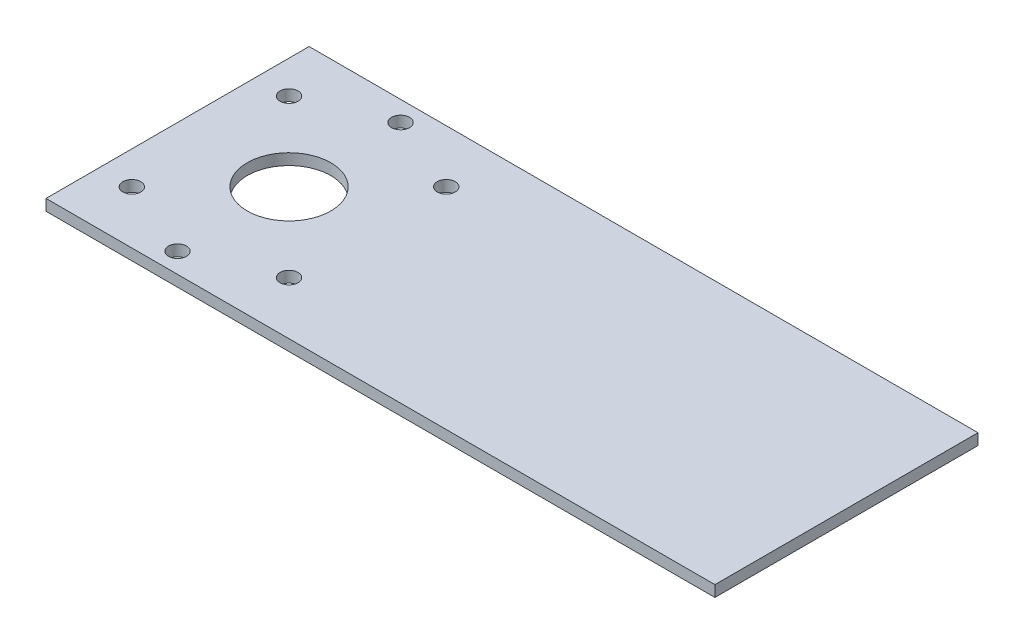
ISO-10303-21;
HEADER;
FILE_DESCRIPTION(('STEP AP214'),'2;1');
FILE_NAME('part.step','',(''),(''),'','','');
FILE_SCHEMA(('AUTOMOTIVE_DESIGN { 1 0 10303 214 1 1 1 1 }'));
ENDSEC;
DATA;
#1=APPLICATION_CONTEXT('core data for automotive mechanical design processes');
#2=APPLICATION_PROTOCOL_DEFINITION('international standard','automotive_design',2000,#1);
#3=PRODUCT_CONTEXT('',#1,'mechanical');
#4=PRODUCT('Part','Part','',(#3));
#5=PRODUCT_RELATED_PRODUCT_CATEGORY('part','',(#4));
#6=PRODUCT_DEFINITION_FORMATION('','',#4);
#7=PRODUCT_DEFINITION_CONTEXT('part definition',#1,'design');
#8=PRODUCT_DEFINITION('design','',#6,#7);
#9=PRODUCT_DEFINITION_SHAPE('','',#8);
#10=(LENGTH_UNIT() NAMED_UNIT(*) SI_UNIT(.MILLI.,.METRE.));
#11=(NAMED_UNIT(*) PLANE_ANGLE_UNIT() SI_UNIT($,.RADIAN.));
#12=(NAMED_UNIT(*) SI_UNIT($,.STERADIAN.) SOLID_ANGLE_UNIT());
#13=UNCERTAINTY_MEASURE_WITH_UNIT(LENGTH_MEASURE(1.E-05),#10,'distance_accuracy_value','');
#14=(GEOMETRIC_REPRESENTATION_CONTEXT(3) GLOBAL_UNCERTAINTY_ASSIGNED_CONTEXT((#13)) GLOBAL_UNIT_ASSIGNED_CONTEXT((#10,
#11,#12)) REPRESENTATION_CONTEXT('',''));
#15=CARTESIAN_POINT('',(0.,0.,0.));
#16=DIRECTION('',(0.,0.,1.));
#17=DIRECTION('',(1.,0.,0.));
#18=AXIS2_PLACEMENT_3D('',#15,#16,#17);
#19=CARTESIAN_POINT('',(-152.4,2.54,-59.944));
#20=DIRECTION('',(1.,0.,0.));
#21=DIRECTION('',(0.,0.,-1.));
#22=AXIS2_PLACEMENT_3D('',#19,#20,#21);
#23=PLANE('',#22);
#24=DIRECTION('',(0.,0.,1.));
#25=VECTOR('',#24,1.);
#26=CARTESIAN_POINT('',(-152.4,0.,-59.944));
#27=LINE('',#26,#25);
#28=CARTESIAN_POINT('',(-152.4,0.,-59.944));
#29=VERTEX_POINT('',#28);
#30=CARTESIAN_POINT('',(-152.4,0.,0.));
#31=VERTEX_POINT('',#30);
#32=EDGE_CURVE('E102',#29,#31,#27,.T.);
#33=ORIENTED_EDGE('',*,*,#32,.T.);
#34=DIRECTION('',(0.,-1.,0.));
#35=VECTOR('',#34,1.);
#36=CARTESIAN_POINT('',(-152.4,2.54,0.));
#37=LINE('',#36,#35);
#38=CARTESIAN_POINT('',(-152.4,2.54,0.));
#39=VERTEX_POINT('',#38);
#40=EDGE_CURVE('E11',#39,#31,#37,.T.);
#41=ORIENTED_EDGE('',*,*,#40,.F.);
#42=DIRECTION('',(0.,0.,1.));
#43=VECTOR('',#42,1.);
#44=CARTESIAN_POINT('',(-152.4,2.54,-59.944));
#45=LINE('',#44,#43);
#46=CARTESIAN_POINT('',(-152.4,2.54,-59.944));
#47=VERTEX_POINT('',#46);
#48=EDGE_CURVE('E90',#47,#39,#45,.T.);
#49=ORIENTED_EDGE('',*,*,#48,.F.);
#50=DIRECTION('',(0.,-1.,0.));
#51=VECTOR('',#50,1.);
#52=CARTESIAN_POINT('',(-152.4,2.54,-59.944));
#53=LINE('',#52,#51);
#54=EDGE_CURVE('E98',#47,#29,#53,.T.);
#55=ORIENTED_EDGE('',*,*,#54,.T.);
#56=EDGE_LOOP('',(#33,#41,#49,#55));
#57=FACE_BOUND('',#56,.T.);
#58=ADVANCED_FACE('F39',(#57),#23,.F.);
#59=CARTESIAN_POINT('',(-152.4,2.54,0.));
#60=DIRECTION('',(0.,0.,-1.));
#61=DIRECTION('',(-1.,0.,0.));
#62=AXIS2_PLACEMENT_3D('',#59,#60,#61);
#63=PLANE('',#62);
#64=DIRECTION('',(1.,0.,0.));
#65=VECTOR('',#64,1.);
#66=CARTESIAN_POINT('',(-152.4,0.,0.));
#67=LINE('',#66,#65);
#68=CARTESIAN_POINT('',(0.,0.,0.));
#69=VERTEX_POINT('',#68);
#70=EDGE_CURVE('E94',#31,#69,#67,.T.);
#71=ORIENTED_EDGE('',*,*,#70,.T.);
#72=DIRECTION('',(0.,-1.,0.));
#73=VECTOR('',#72,1.);
#74=CARTESIAN_POINT('',(0.,2.54,0.));
#75=LINE('',#74,#73);
#76=CARTESIAN_POINT('',(0.,2.54,0.));
#77=VERTEX_POINT('',#76);
#78=EDGE_CURVE('E47',#77,#69,#75,.T.);
#79=ORIENTED_EDGE('',*,*,#78,.F.);
#80=DIRECTION('',(1.,0.,0.));
#81=VECTOR('',#80,1.);
#82=CARTESIAN_POINT('',(-152.4,2.54,0.));
#83=LINE('',#82,#81);
#84=EDGE_CURVE('E85',#39,#77,#83,.T.);
#85=ORIENTED_EDGE('',*,*,#84,.F.);
#86=ORIENTED_EDGE('',*,*,#40,.T.);
#87=EDGE_LOOP('',(#71,#79,#85,#86));
#88=FACE_BOUND('',#87,.T.);
#89=ADVANCED_FACE('F93',(#88),#63,.F.);
#90=CARTESIAN_POINT('',(0.,2.54,-59.944));
#91=DIRECTION('',(-1.,0.,0.));
#92=DIRECTION('',(0.,0.,1.));
#93=AXIS2_PLACEMENT_3D('',#90,#91,#92);
#94=PLANE('',#93);
#95=DIRECTION('',(0.,0.,-1.));
#96=VECTOR('',#95,1.);
#97=CARTESIAN_POINT('',(0.,0.,-59.944));
#98=LINE('',#97,#96);
#99=CARTESIAN_POINT('',(0.,0.,-59.944));
#100=VERTEX_POINT('',#99);
#101=EDGE_CURVE('E72',#69,#100,#98,.T.);
#102=ORIENTED_EDGE('',*,*,#101,.T.);
#103=DIRECTION('',(0.,-1.,0.));
#104=VECTOR('',#103,1.);
#105=CARTESIAN_POINT('',(0.,2.54,-59.944));
#106=LINE('',#105,#104);
#107=CARTESIAN_POINT('',(0.,2.54,-59.944));
#108=VERTEX_POINT('',#107);
#109=EDGE_CURVE('E95',#108,#100,#106,.T.);
#110=ORIENTED_EDGE('',*,*,#109,.F.);
#111=DIRECTION('',(0.,0.,-1.));
#112=VECTOR('',#111,1.);
#113=CARTESIAN_POINT('',(0.,2.54,-59.944));
#114=LINE('',#113,#112);
#115=EDGE_CURVE('E88',#77,#108,#114,.T.);
#116=ORIENTED_EDGE('',*,*,#115,.F.);
#117=ORIENTED_EDGE('',*,*,#78,.T.);
#118=EDGE_LOOP('',(#102,#110,#116,#117));
#119=FACE_BOUND('',#118,.T.);
#120=ADVANCED_FACE('F96',(#119),#94,.F.);
#121=CARTESIAN_POINT('',(-152.4,2.54,-59.944));
#122=DIRECTION('',(0.,0.,1.));
#123=DIRECTION('',(1.,0.,0.));
#124=AXIS2_PLACEMENT_3D('',#121,#122,#123);
#125=PLANE('',#124);
#126=DIRECTION('',(-1.,0.,0.));
#127=VECTOR('',#126,1.);
#128=CARTESIAN_POINT('',(-152.4,0.,-59.944));
#129=LINE('',#128,#127);
#130=EDGE_CURVE('E78',#100,#29,#129,.T.);
#131=ORIENTED_EDGE('',*,*,#130,.T.);
#132=ORIENTED_EDGE('',*,*,#54,.F.);
#133=DIRECTION('',(-1.,0.,0.));
#134=VECTOR('',#133,1.);
#135=CARTESIAN_POINT('',(-152.4,2.54,-59.944));
#136=LINE('',#135,#134);
#137=EDGE_CURVE('E55',#108,#47,#136,.T.);
#138=ORIENTED_EDGE('',*,*,#137,.F.);
#139=ORIENTED_EDGE('',*,*,#109,.T.);
#140=EDGE_LOOP('',(#131,#132,#138,#139));
#141=FACE_BOUND('',#140,.T.);
#142=ADVANCED_FACE('F110',(#141),#125,.F.);
#143=CARTESIAN_POINT('',(0.,2.54,0.));
#144=DIRECTION('',(0.,1.,0.));
#145=DIRECTION('',(0.,0.,1.));
#146=AXIS2_PLACEMENT_3D('',#143,#144,#145);
#147=PLANE('',#146);
#148=CARTESIAN_POINT('',(-127.,2.54,-29.972));
#149=DIRECTION('',(0.,1.,0.));
#150=DIRECTION('',(0.,0.,1.));
#151=AXIS2_PLACEMENT_3D('',#148,#149,#150);
#152=CIRCLE('',#151,9.52500000000001);
#153=CARTESIAN_POINT('',(-127.,2.54,-20.447));
#154=VERTEX_POINT('',#153);
#155=EDGE_CURVE('E154',#154,#154,#152,.T.);
#156=ORIENTED_EDGE('',*,*,#155,.F.);
#157=EDGE_LOOP('',(#156));
#158=FACE_BOUND('',#157,.T.);
#159=CARTESIAN_POINT('',(-144.907,2.54,-47.879));
#160=DIRECTION('',(0.,1.,0.));
#161=DIRECTION('',(0.,0.,1.));
#162=AXIS2_PLACEMENT_3D('',#159,#160,#161);
#163=CIRCLE('',#162,2.04469999999998);
#164=CARTESIAN_POINT('',(-144.907,2.54,-45.8343));
#165=VERTEX_POINT('',#164);
#166=EDGE_CURVE('E148',#165,#165,#163,.T.);
#167=ORIENTED_EDGE('',*,*,#166,.F.);
#168=EDGE_LOOP('',(#167));
#169=FACE_BOUND('',#168,.T.);
#170=CARTESIAN_POINT('',(-127.,2.54,-55.372));
#171=DIRECTION('',(0.,1.,0.));
#172=DIRECTION('',(0.,0.,1.));
#173=AXIS2_PLACEMENT_3D('',#170,#171,#172);
#174=CIRCLE('',#173,2.04469999999998);
#175=CARTESIAN_POINT('',(-127.,2.54,-53.3273));
#176=VERTEX_POINT('',#175);
#177=EDGE_CURVE('E142',#176,#176,#174,.T.);
#178=ORIENTED_EDGE('',*,*,#177,.F.);
#179=EDGE_LOOP('',(#178));
#180=FACE_BOUND('',#179,.T.);
#181=CARTESIAN_POINT('',(-109.093,2.54,-47.879));
#182=DIRECTION('',(0.,1.,0.));
#183=DIRECTION('',(0.,0.,1.));
#184=AXIS2_PLACEMENT_3D('',#181,#182,#183);
#185=CIRCLE('',#184,2.04469999999998);
#186=CARTESIAN_POINT('',(-109.093,2.54,-45.8343));
#187=VERTEX_POINT('',#186);
#188=EDGE_CURVE('E136',#187,#187,#185,.T.);
#189=ORIENTED_EDGE('',*,*,#188,.F.);
#190=EDGE_LOOP('',(#189));
#191=FACE_BOUND('',#190,.T.);
#192=CARTESIAN_POINT('',(-109.093,2.54,-12.065));
#193=DIRECTION('',(0.,1.,0.));
#194=DIRECTION('',(0.,0.,1.));
#195=AXIS2_PLACEMENT_3D('',#192,#193,#194);
#196=CIRCLE('',#195,2.04469999999998);
#197=CARTESIAN_POINT('',(-109.093,2.54,-10.0203));
#198=VERTEX_POINT('',#197);
#199=EDGE_CURVE('E130',#198,#198,#196,.T.);
#200=ORIENTED_EDGE('',*,*,#199,.F.);
#201=EDGE_LOOP('',(#200));
#202=FACE_BOUND('',#201,.T.);
#203=CARTESIAN_POINT('',(-127.,2.54,-4.572));
#204=DIRECTION('',(0.,1.,0.));
#205=DIRECTION('',(0.,0.,1.));
#206=AXIS2_PLACEMENT_3D('',#203,#204,#205);
#207=CIRCLE('',#206,2.04469999999998);
#208=CARTESIAN_POINT('',(-127.,2.54,-2.52730000000002));
#209=VERTEX_POINT('',#208);
#210=EDGE_CURVE('E124',#209,#209,#207,.T.);
#211=ORIENTED_EDGE('',*,*,#210,.F.);
#212=EDGE_LOOP('',(#211));
#213=FACE_BOUND('',#212,.T.);
#214=CARTESIAN_POINT('',(-144.907,2.54,-12.065));
#215=DIRECTION('',(0.,1.,0.));
#216=DIRECTION('',(0.,0.,1.));
#217=AXIS2_PLACEMENT_3D('',#214,#215,#216);
#218=CIRCLE('',#217,2.04469999999998);
#219=CARTESIAN_POINT('',(-144.907,2.54,-10.0203));
#220=VERTEX_POINT('',#219);
#221=EDGE_CURVE('E118',#220,#220,#218,.T.);
#222=ORIENTED_EDGE('',*,*,#221,.F.);
#223=EDGE_LOOP('',(#222));
#224=FACE_BOUND('',#223,.T.);
#225=ORIENTED_EDGE('',*,*,#48,.T.);
#226=ORIENTED_EDGE('',*,*,#84,.T.);
#227=ORIENTED_EDGE('',*,*,#115,.T.);
#228=ORIENTED_EDGE('',*,*,#137,.T.);
#229=EDGE_LOOP('',(#225,#226,#227,#228));
#230=FACE_BOUND('',#229,.T.);
#231=ADVANCED_FACE('F86',(#158,#169,#180,#191,#202,#213,#224,#230),#147,.T.);
#232=CARTESIAN_POINT('',(0.,0.,0.));
#233=DIRECTION('',(0.,1.,0.));
#234=DIRECTION('',(0.,0.,1.));
#235=AXIS2_PLACEMENT_3D('',#232,#233,#234);
#236=PLANE('',#235);
#237=CARTESIAN_POINT('',(-127.,0.,-29.972));
#238=DIRECTION('',(0.,1.,0.));
#239=DIRECTION('',(0.,0.,1.));
#240=AXIS2_PLACEMENT_3D('',#237,#238,#239);
#241=CIRCLE('',#240,9.52500000000001);
#242=CARTESIAN_POINT('',(-127.,0.,-20.447));
#243=VERTEX_POINT('',#242);
#244=EDGE_CURVE('E151',#243,#243,#241,.T.);
#245=ORIENTED_EDGE('',*,*,#244,.T.);
#246=EDGE_LOOP('',(#245));
#247=FACE_BOUND('',#246,.T.);
#248=CARTESIAN_POINT('',(-144.907,0.,-47.879));
#249=DIRECTION('',(0.,1.,0.));
#250=DIRECTION('',(0.,0.,1.));
#251=AXIS2_PLACEMENT_3D('',#248,#249,#250);
#252=CIRCLE('',#251,2.04469999999998);
#253=CARTESIAN_POINT('',(-144.907,0.,-45.8343));
#254=VERTEX_POINT('',#253);
#255=EDGE_CURVE('E145',#254,#254,#252,.T.);
#256=ORIENTED_EDGE('',*,*,#255,.T.);
#257=EDGE_LOOP('',(#256));
#258=FACE_BOUND('',#257,.T.);
#259=CARTESIAN_POINT('',(-127.,0.,-55.372));
#260=DIRECTION('',(0.,1.,0.));
#261=DIRECTION('',(0.,0.,1.));
#262=AXIS2_PLACEMENT_3D('',#259,#260,#261);
#263=CIRCLE('',#262,2.04469999999998);
#264=CARTESIAN_POINT('',(-127.,0.,-53.3273));
#265=VERTEX_POINT('',#264);
#266=EDGE_CURVE('E139',#265,#265,#263,.T.);
#267=ORIENTED_EDGE('',*,*,#266,.T.);
#268=EDGE_LOOP('',(#267));
#269=FACE_BOUND('',#268,.T.);
#270=CARTESIAN_POINT('',(-109.093,0.,-47.879));
#271=DIRECTION('',(0.,1.,0.));
#272=DIRECTION('',(0.,0.,1.));
#273=AXIS2_PLACEMENT_3D('',#270,#271,#272);
#274=CIRCLE('',#273,2.04469999999998);
#275=CARTESIAN_POINT('',(-109.093,0.,-45.8343));
#276=VERTEX_POINT('',#275);
#277=EDGE_CURVE('E133',#276,#276,#274,.T.);
#278=ORIENTED_EDGE('',*,*,#277,.T.);
#279=EDGE_LOOP('',(#278));
#280=FACE_BOUND('',#279,.T.);
#281=CARTESIAN_POINT('',(-109.093,0.,-12.065));
#282=DIRECTION('',(0.,1.,0.));
#283=DIRECTION('',(0.,0.,1.));
#284=AXIS2_PLACEMENT_3D('',#281,#282,#283);
#285=CIRCLE('',#284,2.04469999999998);
#286=CARTESIAN_POINT('',(-109.093,0.,-10.0203));
#287=VERTEX_POINT('',#286);
#288=EDGE_CURVE('E127',#287,#287,#285,.T.);
#289=ORIENTED_EDGE('',*,*,#288,.T.);
#290=EDGE_LOOP('',(#289));
#291=FACE_BOUND('',#290,.T.);
#292=CARTESIAN_POINT('',(-127.,0.,-4.572));
#293=DIRECTION('',(0.,1.,0.));
#294=DIRECTION('',(0.,0.,1.));
#295=AXIS2_PLACEMENT_3D('',#292,#293,#294);
#296=CIRCLE('',#295,2.04469999999998);
#297=CARTESIAN_POINT('',(-127.,0.,-2.52730000000002));
#298=VERTEX_POINT('',#297);
#299=EDGE_CURVE('E121',#298,#298,#296,.T.);
#300=ORIENTED_EDGE('',*,*,#299,.T.);
#301=EDGE_LOOP('',(#300));
#302=FACE_BOUND('',#301,.T.);
#303=CARTESIAN_POINT('',(-144.907,0.,-12.065));
#304=DIRECTION('',(0.,1.,0.));
#305=DIRECTION('',(0.,0.,1.));
#306=AXIS2_PLACEMENT_3D('',#303,#304,#305);
#307=CIRCLE('',#306,2.04469999999998);
#308=CARTESIAN_POINT('',(-144.907,0.,-10.0203));
#309=VERTEX_POINT('',#308);
#310=EDGE_CURVE('E105',#309,#309,#307,.T.);
#311=ORIENTED_EDGE('',*,*,#310,.T.);
#312=EDGE_LOOP('',(#311));
#313=FACE_BOUND('',#312,.T.);
#314=ORIENTED_EDGE('',*,*,#32,.F.);
#315=ORIENTED_EDGE('',*,*,#130,.F.);
#316=ORIENTED_EDGE('',*,*,#101,.F.);
#317=ORIENTED_EDGE('',*,*,#70,.F.);
#318=EDGE_LOOP('',(#314,#315,#316,#317));
#319=FACE_BOUND('',#318,.T.);
#320=ADVANCED_FACE('F113',(#247,#258,#269,#280,#291,#302,#313,#319),#236,.F.);
#321=CARTESIAN_POINT('',(-144.907,2.54,-12.065));
#322=DIRECTION('',(0.,1.,0.));
#323=DIRECTION('',(0.,0.,1.));
#324=AXIS2_PLACEMENT_3D('',#321,#322,#323);
#325=CYLINDRICAL_SURFACE('',#324,2.04469999999998);
#326=ORIENTED_EDGE('',*,*,#310,.F.);
#327=EDGE_LOOP('',(#326));
#328=FACE_BOUND('',#327,.T.);
#329=ORIENTED_EDGE('',*,*,#221,.T.);
#330=EDGE_LOOP('',(#329));
#331=FACE_BOUND('',#330,.T.);
#332=ADVANCED_FACE('F175',(#328,#331),#325,.F.);
#333=CARTESIAN_POINT('',(-127.,2.54,-4.572));
#334=DIRECTION('',(0.,1.,0.));
#335=DIRECTION('',(0.,0.,1.));
#336=AXIS2_PLACEMENT_3D('',#333,#334,#335);
#337=CYLINDRICAL_SURFACE('',#336,2.04469999999998);
#338=ORIENTED_EDGE('',*,*,#299,.F.);
#339=EDGE_LOOP('',(#338));
#340=FACE_BOUND('',#339,.T.);
#341=ORIENTED_EDGE('',*,*,#210,.T.);
#342=EDGE_LOOP('',(#341));
#343=FACE_BOUND('',#342,.T.);
#344=ADVANCED_FACE('F177',(#340,#343),#337,.F.);
#345=CARTESIAN_POINT('',(-109.093,2.54,-12.065));
#346=DIRECTION('',(0.,1.,0.));
#347=DIRECTION('',(0.,0.,1.));
#348=AXIS2_PLACEMENT_3D('',#345,#346,#347);
#349=CYLINDRICAL_SURFACE('',#348,2.04469999999998);
#350=ORIENTED_EDGE('',*,*,#288,.F.);
#351=EDGE_LOOP('',(#350));
#352=FACE_BOUND('',#351,.T.);
#353=ORIENTED_EDGE('',*,*,#199,.T.);
#354=EDGE_LOOP('',(#353));
#355=FACE_BOUND('',#354,.T.);
#356=ADVANCED_FACE('F184',(#352,#355),#349,.F.);
#357=CARTESIAN_POINT('',(-109.093,2.54,-47.879));
#358=DIRECTION('',(0.,1.,0.));
#359=DIRECTION('',(0.,0.,1.));
#360=AXIS2_PLACEMENT_3D('',#357,#358,#359);
#361=CYLINDRICAL_SURFACE('',#360,2.04469999999998);
#362=ORIENTED_EDGE('',*,*,#277,.F.);
#363=EDGE_LOOP('',(#362));
#364=FACE_BOUND('',#363,.T.);
#365=ORIENTED_EDGE('',*,*,#188,.T.);
#366=EDGE_LOOP('',(#365));
#367=FACE_BOUND('',#366,.T.);
#368=ADVANCED_FACE('F244',(#364,#367),#361,.F.);
#369=CARTESIAN_POINT('',(-127.,2.54,-55.372));
#370=DIRECTION('',(0.,1.,0.));
#371=DIRECTION('',(0.,0.,1.));
#372=AXIS2_PLACEMENT_3D('',#369,#370,#371);
#373=CYLINDRICAL_SURFACE('',#372,2.04469999999998);
#374=ORIENTED_EDGE('',*,*,#266,.F.);
#375=EDGE_LOOP('',(#374));
#376=FACE_BOUND('',#375,.T.);
#377=ORIENTED_EDGE('',*,*,#177,.T.);
#378=EDGE_LOOP('',(#377));
#379=FACE_BOUND('',#378,.T.);
#380=ADVANCED_FACE('F253',(#376,#379),#373,.F.);
#381=CARTESIAN_POINT('',(-144.907,2.54,-47.879));
#382=DIRECTION('',(0.,1.,0.));
#383=DIRECTION('',(0.,0.,1.));
#384=AXIS2_PLACEMENT_3D('',#381,#382,#383);
#385=CYLINDRICAL_SURFACE('',#384,2.04469999999998);
#386=ORIENTED_EDGE('',*,*,#255,.F.);
#387=EDGE_LOOP('',(#386));
#388=FACE_BOUND('',#387,.T.);
#389=ORIENTED_EDGE('',*,*,#166,.T.);
#390=EDGE_LOOP('',(#389));
#391=FACE_BOUND('',#390,.T.);
#392=ADVANCED_FACE('F262',(#388,#391),#385,.F.);
#393=CARTESIAN_POINT('',(-127.,2.54,-29.972));
#394=DIRECTION('',(0.,1.,0.));
#395=DIRECTION('',(0.,0.,1.));
#396=AXIS2_PLACEMENT_3D('',#393,#394,#395);
#397=CYLINDRICAL_SURFACE('',#396,9.52500000000001);
#398=ORIENTED_EDGE('',*,*,#244,.F.);
#399=EDGE_LOOP('',(#398));
#400=FACE_BOUND('',#399,.T.);
#401=ORIENTED_EDGE('',*,*,#155,.T.);
#402=EDGE_LOOP('',(#401));
#403=FACE_BOUND('',#402,.T.);
#404=ADVANCED_FACE('F158',(#400,#403),#397,.F.);
#405=CLOSED_SHELL('',(#58,#89,#120,#142,#231,#320,#332,#344,#356,#368,#380,#392,#404));
#406=MANIFOLD_SOLID_BREP('B2',#405);
#407=ADVANCED_BREP_SHAPE_REPRESENTATION('',(#18,#406),#14);
#408=SHAPE_DEFINITION_REPRESENTATION(#9,#407);
ENDSEC;
END-ISO-10303-21;
